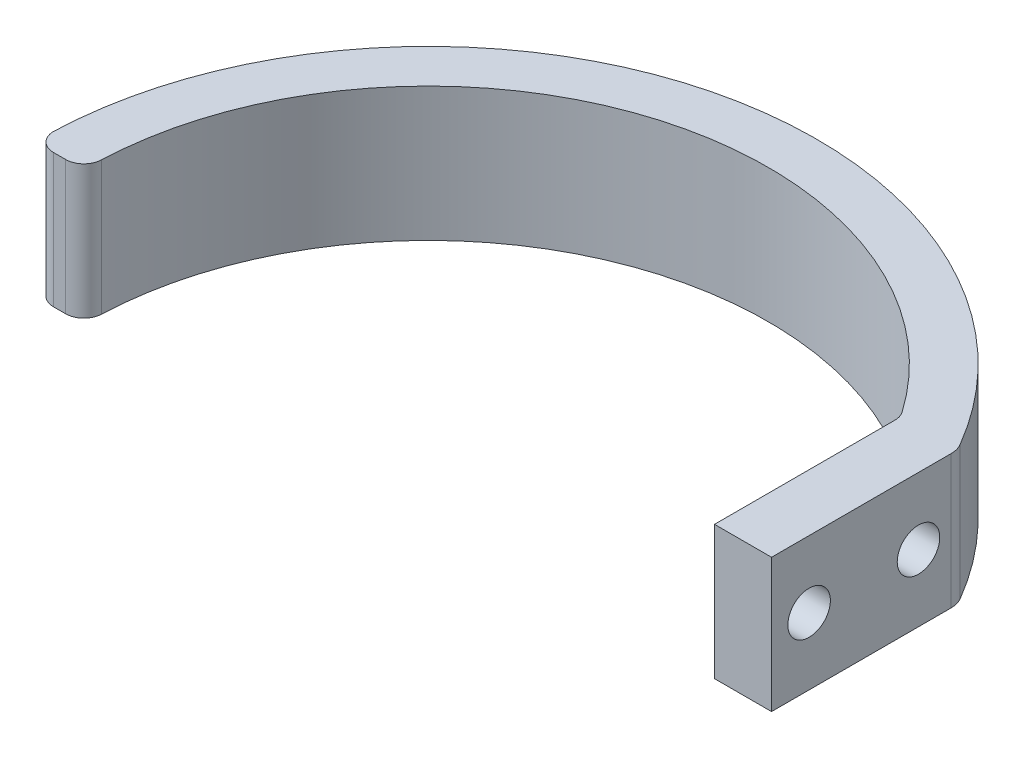
ISO-10303-21;
HEADER;
FILE_DESCRIPTION(('STEP AP214'),'2;1');
FILE_NAME('part.step','',(''),(''),'','','');
FILE_SCHEMA(('AUTOMOTIVE_DESIGN { 1 0 10303 214 1 1 1 1 }'));
ENDSEC;
DATA;
#1=APPLICATION_CONTEXT('core data for automotive mechanical design processes');
#2=APPLICATION_PROTOCOL_DEFINITION('international standard','automotive_design',2000,#1);
#3=PRODUCT_CONTEXT('',#1,'mechanical');
#4=PRODUCT('Part','Part','',(#3));
#5=PRODUCT_RELATED_PRODUCT_CATEGORY('part','',(#4));
#6=PRODUCT_DEFINITION_FORMATION('','',#4);
#7=PRODUCT_DEFINITION_CONTEXT('part definition',#1,'design');
#8=PRODUCT_DEFINITION('design','',#6,#7);
#9=PRODUCT_DEFINITION_SHAPE('','',#8);
#10=(LENGTH_UNIT() NAMED_UNIT(*) SI_UNIT(.MILLI.,.METRE.));
#11=(NAMED_UNIT(*) PLANE_ANGLE_UNIT() SI_UNIT($,.RADIAN.));
#12=(NAMED_UNIT(*) SI_UNIT($,.STERADIAN.) SOLID_ANGLE_UNIT());
#13=UNCERTAINTY_MEASURE_WITH_UNIT(LENGTH_MEASURE(1.E-05),#10,'distance_accuracy_value','');
#14=(GEOMETRIC_REPRESENTATION_CONTEXT(3) GLOBAL_UNCERTAINTY_ASSIGNED_CONTEXT((#13)) GLOBAL_UNIT_ASSIGNED_CONTEXT((#10,
#11,#12)) REPRESENTATION_CONTEXT('',''));
#15=CARTESIAN_POINT('',(0.,0.,0.));
#16=DIRECTION('',(0.,0.,1.));
#17=DIRECTION('',(1.,0.,0.));
#18=AXIS2_PLACEMENT_3D('',#15,#16,#17);
#19=CARTESIAN_POINT('',(-31.998102941756,11.,0.348436692648757));
#20=DIRECTION('',(0.,0.,-1.));
#21=DIRECTION('',(-1.,0.,0.));
#22=AXIS2_PLACEMENT_3D('',#19,#20,#21);
#23=PLANE('',#22);
#24=DIRECTION('',(1.,0.,0.));
#25=VECTOR('',#24,1.);
#26=CARTESIAN_POINT('',(-31.998102941756,11.,0.348436692648757));
#27=LINE('',#26,#25);
#28=CARTESIAN_POINT('',(-30.4782529346608,11.,0.348436692648757));
#29=VERTEX_POINT('',#28);
#30=CARTESIAN_POINT('',(-29.477786406651,11.,0.348436692648757));
#31=VERTEX_POINT('',#30);
#32=EDGE_CURVE('E136',#29,#31,#27,.T.);
#33=ORIENTED_EDGE('',*,*,#32,.F.);
#34=DIRECTION('',(0.,-1.,0.));
#35=VECTOR('',#34,1.);
#36=CARTESIAN_POINT('',(-30.4782529346608,11.,0.348436692648757));
#37=LINE('',#36,#35);
#38=CARTESIAN_POINT('',(-30.4782529346608,0.,0.348436692648757));
#39=VERTEX_POINT('',#38);
#40=EDGE_CURVE('E156',#29,#39,#37,.T.);
#41=ORIENTED_EDGE('',*,*,#40,.T.);
#42=DIRECTION('',(1.,0.,0.));
#43=VECTOR('',#42,1.);
#44=CARTESIAN_POINT('',(-31.998102941756,0.,0.348436692648757));
#45=LINE('',#44,#43);
#46=CARTESIAN_POINT('',(-29.477786406651,0.,0.348436692648757));
#47=VERTEX_POINT('',#46);
#48=EDGE_CURVE('E138',#39,#47,#45,.T.);
#49=ORIENTED_EDGE('',*,*,#48,.T.);
#50=DIRECTION('',(0.,-1.,0.));
#51=VECTOR('',#50,1.);
#52=CARTESIAN_POINT('',(-29.477786406651,11.,0.348436692648757));
#53=LINE('',#52,#51);
#54=EDGE_CURVE('E154',#47,#31,#53,.F.);
#55=ORIENTED_EDGE('',*,*,#54,.T.);
#56=EDGE_LOOP('',(#33,#41,#49,#55));
#57=FACE_BOUND('',#56,.T.);
#58=ADVANCED_FACE('F41',(#57),#23,.F.);
#59=CARTESIAN_POINT('',(0.,11.,0.));
#60=DIRECTION('',(0.,-1.,0.));
#61=DIRECTION('',(0.,0.,-1.));
#62=AXIS2_PLACEMENT_3D('',#59,#60,#61);
#63=CYLINDRICAL_SURFACE('',#62,28.000271007009);
#64=CARTESIAN_POINT('',(0.,11.,0.));
#65=DIRECTION('',(0.,-1.,0.));
#66=DIRECTION('',(0.,0.,-1.));
#67=AXIS2_PLACEMENT_3D('',#64,#65,#66);
#68=CIRCLE('',#67,28.000271007009);
#69=CARTESIAN_POINT('',(-27.9789296809121,11.,-1.09300977878818));
#70=VERTEX_POINT('',#69);
#71=CARTESIAN_POINT('',(22.9416876007875,11.,-16.0528547770738));
#72=VERTEX_POINT('',#71);
#73=EDGE_CURVE('E197',#70,#72,#68,.T.);
#74=ORIENTED_EDGE('',*,*,#73,.F.);
#75=DIRECTION('',(0.,-1.,0.));
#76=VECTOR('',#75,1.);
#77=CARTESIAN_POINT('',(-27.9789296809121,11.,-1.09300977878818));
#78=LINE('',#77,#76);
#79=CARTESIAN_POINT('',(-27.9789296809121,0.,-1.09300977878818));
#80=VERTEX_POINT('',#79);
#81=EDGE_CURVE('E171',#70,#80,#78,.T.);
#82=ORIENTED_EDGE('',*,*,#81,.T.);
#83=CARTESIAN_POINT('',(0.,0.,0.));
#84=DIRECTION('',(0.,-1.,0.));
#85=DIRECTION('',(0.,0.,-1.));
#86=AXIS2_PLACEMENT_3D('',#83,#84,#85);
#87=CIRCLE('',#86,28.000271007009);
#88=CARTESIAN_POINT('',(22.9416876007875,0.,-16.0528547770738));
#89=VERTEX_POINT('',#88);
#90=EDGE_CURVE('E135',#80,#89,#87,.T.);
#91=ORIENTED_EDGE('',*,*,#90,.T.);
#92=DIRECTION('',(0.,-1.,0.));
#93=VECTOR('',#92,1.);
#94=CARTESIAN_POINT('',(22.9416876007876,11.,-16.0528547770738));
#95=LINE('',#94,#93);
#96=EDGE_CURVE('E143',#89,#72,#95,.F.);
#97=ORIENTED_EDGE('',*,*,#96,.T.);
#98=EDGE_LOOP('',(#74,#82,#91,#97));
#99=FACE_BOUND('',#98,.T.);
#100=ADVANCED_FACE('F247',(#99),#63,.F.);
#101=CARTESIAN_POINT('',(31.998102941756,11.,-0.348436692650954));
#102=DIRECTION('',(0.,0.,1.));
#103=DIRECTION('',(1.,0.,0.));
#104=AXIS2_PLACEMENT_3D('',#101,#102,#103);
#105=PLANE('',#104);
#106=DIRECTION('',(0.,1.,0.));
#107=VECTOR('',#106,1.);
#108=CARTESIAN_POINT('',(27.9072277437628,-0.000999999999999265,-0.348436692650954));
#109=LINE('',#108,#107);
#110=CARTESIAN_POINT('',(27.9072277437628,0.,-0.348436692650957));
#111=VERTEX_POINT('',#110);
#112=CARTESIAN_POINT('',(27.9072277437628,11.,-0.348436692650954));
#113=VERTEX_POINT('',#112);
#114=EDGE_CURVE('E123',#111,#113,#109,.T.);
#115=ORIENTED_EDGE('',*,*,#114,.T.);
#116=DIRECTION('',(-1.,0.,0.));
#117=VECTOR('',#116,1.);
#118=CARTESIAN_POINT('',(31.998102941756,11.,-0.348436692650954));
#119=LINE('',#118,#117);
#120=CARTESIAN_POINT('',(23.2126805175144,11.,-0.348436692650953));
#121=VERTEX_POINT('',#120);
#122=EDGE_CURVE('E199',#113,#121,#119,.T.);
#123=ORIENTED_EDGE('',*,*,#122,.T.);
#124=DIRECTION('',(0.,1.,0.));
#125=VECTOR('',#124,1.);
#126=CARTESIAN_POINT('',(23.2126805175144,0.,-0.348436692650953));
#127=LINE('',#126,#125);
#128=CARTESIAN_POINT('',(23.2126805175144,0.,-0.348436692650953));
#129=VERTEX_POINT('',#128);
#130=EDGE_CURVE('E132',#129,#121,#127,.T.);
#131=ORIENTED_EDGE('',*,*,#130,.F.);
#132=DIRECTION('',(-1.,0.,0.));
#133=VECTOR('',#132,1.);
#134=CARTESIAN_POINT('',(31.998102941756,0.,-0.348436692650954));
#135=LINE('',#134,#133);
#136=EDGE_CURVE('E118',#111,#129,#135,.T.);
#137=ORIENTED_EDGE('',*,*,#136,.F.);
#138=EDGE_LOOP('',(#115,#123,#131,#137));
#139=FACE_BOUND('',#138,.T.);
#140=ADVANCED_FACE('F130',(#139),#105,.T.);
#141=CARTESIAN_POINT('',(0.,11.,0.));
#142=DIRECTION('',(0.,-1.,0.));
#143=DIRECTION('',(0.,0.,-1.));
#144=AXIS2_PLACEMENT_3D('',#141,#142,#143);
#145=CYLINDRICAL_SURFACE('',#144,32.);
#146=CARTESIAN_POINT('',(0.,11.,0.));
#147=DIRECTION('',(0.,1.,0.));
#148=DIRECTION('',(0.,0.,1.));
#149=AXIS2_PLACEMENT_3D('',#146,#147,#148);
#150=CIRCLE('',#149,32.);
#151=CARTESIAN_POINT('',(27.6343762600136,11.,-16.1350937003786));
#152=VERTEX_POINT('',#151);
#153=CARTESIAN_POINT('',(-31.9771834068573,11.,-1.20819756836852));
#154=VERTEX_POINT('',#153);
#155=EDGE_CURVE('E147',#152,#154,#150,.T.);
#156=ORIENTED_EDGE('',*,*,#155,.F.);
#157=DIRECTION('',(0.,-1.,0.));
#158=VECTOR('',#157,1.);
#159=CARTESIAN_POINT('',(27.6343762600136,11.,-16.1350937003786));
#160=LINE('',#159,#158);
#161=CARTESIAN_POINT('',(27.6343762600136,0.,-16.1350937003786));
#162=VERTEX_POINT('',#161);
#163=EDGE_CURVE('E174',#152,#162,#160,.T.);
#164=ORIENTED_EDGE('',*,*,#163,.T.);
#165=CARTESIAN_POINT('',(0.,0.,0.));
#166=DIRECTION('',(0.,1.,0.));
#167=DIRECTION('',(0.,0.,1.));
#168=AXIS2_PLACEMENT_3D('',#165,#166,#167);
#169=CIRCLE('',#168,32.);
#170=CARTESIAN_POINT('',(-31.9771834068573,0.,-1.20819756836852));
#171=VERTEX_POINT('',#170);
#172=EDGE_CURVE('E134',#162,#171,#169,.T.);
#173=ORIENTED_EDGE('',*,*,#172,.T.);
#174=DIRECTION('',(0.,-1.,0.));
#175=VECTOR('',#174,1.);
#176=CARTESIAN_POINT('',(-31.9771834068573,11.,-1.20819756836852));
#177=LINE('',#176,#175);
#178=EDGE_CURVE('E164',#171,#154,#177,.F.);
#179=ORIENTED_EDGE('',*,*,#178,.T.);
#180=EDGE_LOOP('',(#156,#164,#173,#179));
#181=FACE_BOUND('',#180,.T.);
#182=ADVANCED_FACE('F180',(#181),#145,.T.);
#183=CARTESIAN_POINT('',(0.,11.,0.));
#184=DIRECTION('',(0.,-1.,0.));
#185=DIRECTION('',(0.,0.,-1.));
#186=AXIS2_PLACEMENT_3D('',#183,#184,#185);
#187=PLANE('',#186);
#188=DIRECTION('',(0.,0.,1.));
#189=VECTOR('',#188,1.);
#190=CARTESIAN_POINT('',(27.9072277437628,11.,-15.658436692651));
#191=LINE('',#190,#189);
#192=CARTESIAN_POINT('',(27.9072277437628,11.,-15.1266503441049));
#193=VERTEX_POINT('',#192);
#194=EDGE_CURVE('E120',#193,#113,#191,.T.);
#195=ORIENTED_EDGE('',*,*,#194,.F.);
#196=CARTESIAN_POINT('',(25.9072277437628,11.,-15.1266503441049));
#197=DIRECTION('',(0.,-1.,0.));
#198=DIRECTION('',(0.,0.,-1.));
#199=AXIS2_PLACEMENT_3D('',#196,#197,#198);
#200=CIRCLE('',#199,2.);
#201=EDGE_CURVE('E12',#193,#152,#200,.F.);
#202=ORIENTED_EDGE('',*,*,#201,.T.);
#203=ORIENTED_EDGE('',*,*,#155,.T.);
#204=CARTESIAN_POINT('',(-30.4782529346608,11.,-1.15156330735124));
#205=DIRECTION('',(0.,-1.,0.));
#206=DIRECTION('',(0.,0.,-1.));
#207=AXIS2_PLACEMENT_3D('',#204,#205,#206);
#208=CIRCLE('',#207,1.5);
#209=EDGE_CURVE('E169',#154,#29,#208,.F.);
#210=ORIENTED_EDGE('',*,*,#209,.T.);
#211=ORIENTED_EDGE('',*,*,#32,.T.);
#212=CARTESIAN_POINT('',(-29.477786406651,11.,-1.15156330735124));
#213=DIRECTION('',(0.,-1.,0.));
#214=DIRECTION('',(0.,0.,-1.));
#215=AXIS2_PLACEMENT_3D('',#212,#213,#214);
#216=CIRCLE('',#215,1.5);
#217=EDGE_CURVE('E167',#31,#70,#216,.F.);
#218=ORIENTED_EDGE('',*,*,#217,.T.);
#219=ORIENTED_EDGE('',*,*,#73,.T.);
#220=CARTESIAN_POINT('',(21.7126805175144,11.,-15.1928887374743));
#221=DIRECTION('',(0.,-1.,0.));
#222=DIRECTION('',(0.,0.,-1.));
#223=AXIS2_PLACEMENT_3D('',#220,#221,#222);
#224=CIRCLE('',#223,1.5);
#225=CARTESIAN_POINT('',(23.2126805175144,11.,-15.1928887374743));
#226=VERTEX_POINT('',#225);
#227=EDGE_CURVE('E149',#72,#226,#224,.T.);
#228=ORIENTED_EDGE('',*,*,#227,.T.);
#229=DIRECTION('',(0.,0.,1.));
#230=VECTOR('',#229,1.);
#231=CARTESIAN_POINT('',(23.2126805175144,11.,-0.348436692650953));
#232=LINE('',#231,#230);
#233=EDGE_CURVE('E208',#226,#121,#232,.T.);
#234=ORIENTED_EDGE('',*,*,#233,.T.);
#235=ORIENTED_EDGE('',*,*,#122,.F.);
#236=EDGE_LOOP('',(#195,#202,#203,#210,#211,#218,#219,#228,#234,#235));
#237=FACE_BOUND('',#236,.T.);
#238=ADVANCED_FACE('F193',(#237),#187,.F.);
#239=CARTESIAN_POINT('',(0.,0.,0.));
#240=DIRECTION('',(0.,-1.,0.));
#241=DIRECTION('',(0.,0.,-1.));
#242=AXIS2_PLACEMENT_3D('',#239,#240,#241);
#243=PLANE('',#242);
#244=ORIENTED_EDGE('',*,*,#172,.F.);
#245=CARTESIAN_POINT('',(25.9072277437628,0.,-15.1266503441049));
#246=DIRECTION('',(0.,-1.,0.));
#247=DIRECTION('',(0.,0.,-1.));
#248=AXIS2_PLACEMENT_3D('',#245,#246,#247);
#249=CIRCLE('',#248,2.);
#250=CARTESIAN_POINT('',(27.9072277437628,0.,-15.1266503441049));
#251=VERTEX_POINT('',#250);
#252=EDGE_CURVE('E63',#162,#251,#249,.T.);
#253=ORIENTED_EDGE('',*,*,#252,.T.);
#254=DIRECTION('',(0.,0.,1.));
#255=VECTOR('',#254,1.);
#256=CARTESIAN_POINT('',(27.9072277437628,0.,-15.658436692651));
#257=LINE('',#256,#255);
#258=EDGE_CURVE('E113',#251,#111,#257,.T.);
#259=ORIENTED_EDGE('',*,*,#258,.T.);
#260=ORIENTED_EDGE('',*,*,#136,.T.);
#261=DIRECTION('',(0.,0.,1.));
#262=VECTOR('',#261,1.);
#263=CARTESIAN_POINT('',(23.2126805175144,0.,-0.348436692650953));
#264=LINE('',#263,#262);
#265=CARTESIAN_POINT('',(23.2126805175144,0.,-15.1928887374743));
#266=VERTEX_POINT('',#265);
#267=EDGE_CURVE('E205',#266,#129,#264,.T.);
#268=ORIENTED_EDGE('',*,*,#267,.F.);
#269=CARTESIAN_POINT('',(21.7126805175144,0.,-15.1928887374743));
#270=DIRECTION('',(0.,-1.,0.));
#271=DIRECTION('',(0.,0.,-1.));
#272=AXIS2_PLACEMENT_3D('',#269,#270,#271);
#273=CIRCLE('',#272,1.5);
#274=EDGE_CURVE('E151',#266,#89,#273,.F.);
#275=ORIENTED_EDGE('',*,*,#274,.T.);
#276=ORIENTED_EDGE('',*,*,#90,.F.);
#277=CARTESIAN_POINT('',(-29.477786406651,0.,-1.15156330735124));
#278=DIRECTION('',(0.,-1.,0.));
#279=DIRECTION('',(0.,0.,-1.));
#280=AXIS2_PLACEMENT_3D('',#277,#278,#279);
#281=CIRCLE('',#280,1.5);
#282=EDGE_CURVE('E159',#80,#47,#281,.T.);
#283=ORIENTED_EDGE('',*,*,#282,.T.);
#284=ORIENTED_EDGE('',*,*,#48,.F.);
#285=CARTESIAN_POINT('',(-30.4782529346608,0.,-1.15156330735124));
#286=DIRECTION('',(0.,-1.,0.));
#287=DIRECTION('',(0.,0.,-1.));
#288=AXIS2_PLACEMENT_3D('',#285,#286,#287);
#289=CIRCLE('',#288,1.5);
#290=EDGE_CURVE('E161',#39,#171,#289,.T.);
#291=ORIENTED_EDGE('',*,*,#290,.T.);
#292=EDGE_LOOP('',(#244,#253,#259,#260,#268,#275,#276,#283,#284,#291));
#293=FACE_BOUND('',#292,.T.);
#294=ADVANCED_FACE('F115',(#293),#243,.T.);
#295=CARTESIAN_POINT('',(23.2126805175144,0.,-0.348436692650953));
#296=DIRECTION('',(-1.,0.,0.));
#297=DIRECTION('',(0.,0.,1.));
#298=AXIS2_PLACEMENT_3D('',#295,#296,#297);
#299=PLANE('',#298);
#300=CARTESIAN_POINT('',(23.2126805175144,5.5,-3.43943381526114));
#301=DIRECTION('',(-1.,0.,0.));
#302=DIRECTION('',(0.,0.,1.));
#303=AXIS2_PLACEMENT_3D('',#300,#301,#302);
#304=CIRCLE('',#303,1.75);
#305=CARTESIAN_POINT('',(23.2126805175144,5.5,-1.68943381526114));
#306=VERTEX_POINT('',#305);
#307=EDGE_CURVE('E211',#306,#306,#304,.F.);
#308=ORIENTED_EDGE('',*,*,#307,.T.);
#309=EDGE_LOOP('',(#308));
#310=FACE_BOUND('',#309,.T.);
#311=CARTESIAN_POINT('',(23.2126805175144,5.5,-12.4394338152611));
#312=DIRECTION('',(-1.,0.,0.));
#313=DIRECTION('',(0.,0.,1.));
#314=AXIS2_PLACEMENT_3D('',#311,#312,#313);
#315=CIRCLE('',#314,1.75);
#316=CARTESIAN_POINT('',(23.2126805175144,5.5,-10.6894338152611));
#317=VERTEX_POINT('',#316);
#318=EDGE_CURVE('E213',#317,#317,#315,.F.);
#319=ORIENTED_EDGE('',*,*,#318,.T.);
#320=EDGE_LOOP('',(#319));
#321=FACE_BOUND('',#320,.T.);
#322=ORIENTED_EDGE('',*,*,#233,.F.);
#323=DIRECTION('',(0.,-1.,0.));
#324=VECTOR('',#323,1.);
#325=CARTESIAN_POINT('',(23.2126805175144,0.,-15.1928887374743));
#326=LINE('',#325,#324);
#327=EDGE_CURVE('E146',#226,#266,#326,.T.);
#328=ORIENTED_EDGE('',*,*,#327,.T.);
#329=ORIENTED_EDGE('',*,*,#267,.T.);
#330=ORIENTED_EDGE('',*,*,#130,.T.);
#331=EDGE_LOOP('',(#322,#328,#329,#330));
#332=FACE_BOUND('',#331,.T.);
#333=ADVANCED_FACE('F234',(#310,#321,#332),#299,.T.);
#334=CARTESIAN_POINT('',(-32.001,5.5,-12.4394338152611));
#335=DIRECTION('',(1.,0.,0.));
#336=DIRECTION('',(0.,0.,-1.));
#337=AXIS2_PLACEMENT_3D('',#334,#335,#336);
#338=CYLINDRICAL_SURFACE('',#337,1.75);
#339=CARTESIAN_POINT('',(27.9072277437628,5.5,-12.4394338152611));
#340=DIRECTION('',(-1.,0.,0.));
#341=DIRECTION('',(0.,0.,1.));
#342=AXIS2_PLACEMENT_3D('',#339,#340,#341);
#343=CIRCLE('',#342,1.75);
#344=CARTESIAN_POINT('',(27.9072277437628,5.5,-10.6894338152611));
#345=VERTEX_POINT('',#344);
#346=EDGE_CURVE('E216',#345,#345,#343,.T.);
#347=ORIENTED_EDGE('',*,*,#346,.F.);
#348=EDGE_LOOP('',(#347));
#349=FACE_BOUND('',#348,.T.);
#350=ORIENTED_EDGE('',*,*,#318,.F.);
#351=EDGE_LOOP('',(#350));
#352=FACE_BOUND('',#351,.T.);
#353=ADVANCED_FACE('F230',(#349,#352),#338,.F.);
#354=CARTESIAN_POINT('',(-32.001,5.5,-3.43943381526114));
#355=DIRECTION('',(1.,0.,0.));
#356=DIRECTION('',(0.,0.,-1.));
#357=AXIS2_PLACEMENT_3D('',#354,#355,#356);
#358=CYLINDRICAL_SURFACE('',#357,1.75);
#359=CARTESIAN_POINT('',(27.9072277437628,5.5,-3.43943381526114));
#360=DIRECTION('',(-1.,0.,0.));
#361=DIRECTION('',(0.,0.,1.));
#362=AXIS2_PLACEMENT_3D('',#359,#360,#361);
#363=CIRCLE('',#362,1.75);
#364=CARTESIAN_POINT('',(27.9072277437628,5.5,-1.68943381526114));
#365=VERTEX_POINT('',#364);
#366=EDGE_CURVE('E127',#365,#365,#363,.T.);
#367=ORIENTED_EDGE('',*,*,#366,.F.);
#368=EDGE_LOOP('',(#367));
#369=FACE_BOUND('',#368,.T.);
#370=ORIENTED_EDGE('',*,*,#307,.F.);
#371=EDGE_LOOP('',(#370));
#372=FACE_BOUND('',#371,.T.);
#373=ADVANCED_FACE('F226',(#369,#372),#358,.F.);
#374=CARTESIAN_POINT('',(21.7126805175144,11.,-15.1928887374743));
#375=DIRECTION('',(0.,-1.,0.));
#376=DIRECTION('',(0.,0.,-1.));
#377=AXIS2_PLACEMENT_3D('',#374,#375,#376);
#378=CYLINDRICAL_SURFACE('',#377,1.5);
#379=ORIENTED_EDGE('',*,*,#274,.F.);
#380=ORIENTED_EDGE('',*,*,#327,.F.);
#381=ORIENTED_EDGE('',*,*,#227,.F.);
#382=ORIENTED_EDGE('',*,*,#96,.F.);
#383=EDGE_LOOP('',(#379,#380,#381,#382));
#384=FACE_BOUND('',#383,.T.);
#385=ADVANCED_FACE('F229',(#384),#378,.F.);
#386=CARTESIAN_POINT('',(-30.4782529346608,11.,-1.15156330735124));
#387=DIRECTION('',(0.,-1.,0.));
#388=DIRECTION('',(0.,0.,-1.));
#389=AXIS2_PLACEMENT_3D('',#386,#387,#388);
#390=CYLINDRICAL_SURFACE('',#389,1.5);
#391=ORIENTED_EDGE('',*,*,#209,.F.);
#392=ORIENTED_EDGE('',*,*,#178,.F.);
#393=ORIENTED_EDGE('',*,*,#290,.F.);
#394=ORIENTED_EDGE('',*,*,#40,.F.);
#395=EDGE_LOOP('',(#391,#392,#393,#394));
#396=FACE_BOUND('',#395,.T.);
#397=ADVANCED_FACE('F189',(#396),#390,.T.);
#398=CARTESIAN_POINT('',(-29.477786406651,11.,-1.15156330735124));
#399=DIRECTION('',(0.,-1.,0.));
#400=DIRECTION('',(0.,0.,-1.));
#401=AXIS2_PLACEMENT_3D('',#398,#399,#400);
#402=CYLINDRICAL_SURFACE('',#401,1.5);
#403=ORIENTED_EDGE('',*,*,#217,.F.);
#404=ORIENTED_EDGE('',*,*,#54,.F.);
#405=ORIENTED_EDGE('',*,*,#282,.F.);
#406=ORIENTED_EDGE('',*,*,#81,.F.);
#407=EDGE_LOOP('',(#403,#404,#405,#406));
#408=FACE_BOUND('',#407,.T.);
#409=ADVANCED_FACE('F250',(#408),#402,.T.);
#410=CARTESIAN_POINT('',(27.9072277437628,-0.000999999999999265,-15.658436692651));
#411=DIRECTION('',(-1.,0.,0.));
#412=DIRECTION('',(0.,0.,1.));
#413=AXIS2_PLACEMENT_3D('',#410,#411,#412);
#414=PLANE('',#413);
#415=ORIENTED_EDGE('',*,*,#346,.T.);
#416=EDGE_LOOP('',(#415));
#417=FACE_BOUND('',#416,.T.);
#418=ORIENTED_EDGE('',*,*,#366,.T.);
#419=EDGE_LOOP('',(#418));
#420=FACE_BOUND('',#419,.T.);
#421=ORIENTED_EDGE('',*,*,#258,.F.);
#422=DIRECTION('',(0.,-1.,0.));
#423=VECTOR('',#422,1.);
#424=CARTESIAN_POINT('',(27.9072277437628,-0.000999999999999265,-15.1266503441049));
#425=LINE('',#424,#423);
#426=EDGE_CURVE('E49',#251,#193,#425,.F.);
#427=ORIENTED_EDGE('',*,*,#426,.T.);
#428=ORIENTED_EDGE('',*,*,#194,.T.);
#429=ORIENTED_EDGE('',*,*,#114,.F.);
#430=EDGE_LOOP('',(#421,#427,#428,#429));
#431=FACE_BOUND('',#430,.T.);
#432=ADVANCED_FACE('F124',(#417,#420,#431),#414,.F.);
#433=CARTESIAN_POINT('',(25.9072277437628,11.,-15.1266503441049));
#434=DIRECTION('',(0.,-1.,0.));
#435=DIRECTION('',(0.,0.,-1.));
#436=AXIS2_PLACEMENT_3D('',#433,#434,#435);
#437=CYLINDRICAL_SURFACE('',#436,2.);
#438=ORIENTED_EDGE('',*,*,#201,.F.);
#439=ORIENTED_EDGE('',*,*,#426,.F.);
#440=ORIENTED_EDGE('',*,*,#252,.F.);
#441=ORIENTED_EDGE('',*,*,#163,.F.);
#442=EDGE_LOOP('',(#438,#439,#440,#441));
#443=FACE_BOUND('',#442,.T.);
#444=ADVANCED_FACE('F43',(#443),#437,.T.);
#445=CLOSED_SHELL('',(#58,#100,#140,#182,#238,#294,#333,#353,#373,#385,#397,#409,#432,#444));
#446=MANIFOLD_SOLID_BREP('B2',#445);
#447=ADVANCED_BREP_SHAPE_REPRESENTATION('',(#18,#446),#14);
#448=SHAPE_DEFINITION_REPRESENTATION(#9,#447);
ENDSEC;
END-ISO-10303-21;
